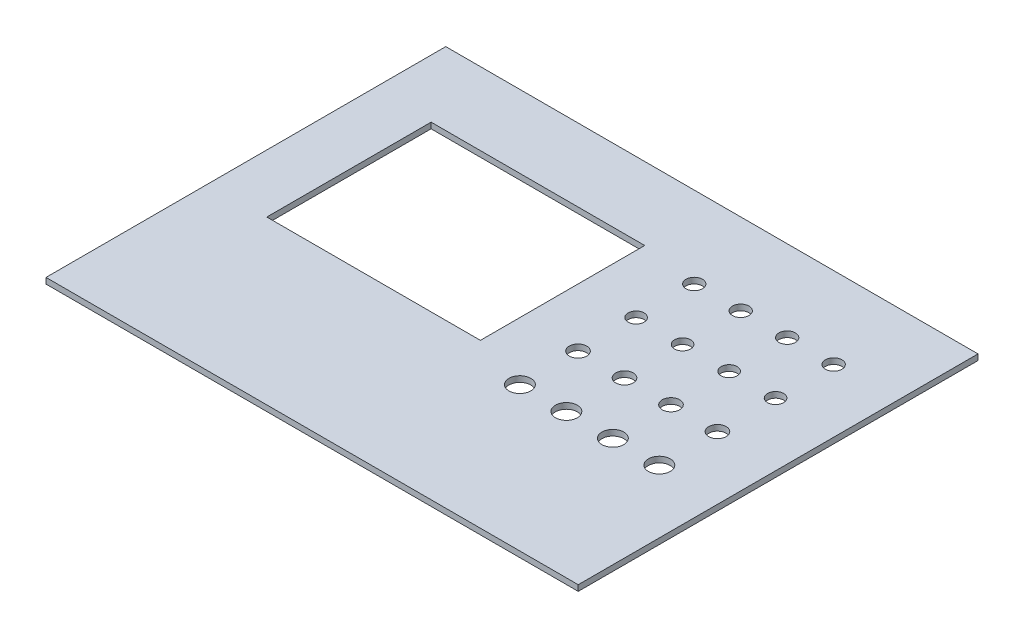
ISO-10303-21;
HEADER;
FILE_DESCRIPTION(('STEP AP214'),'2;1');
FILE_NAME('part.step','',(''),(''),'','','');
FILE_SCHEMA(('AUTOMOTIVE_DESIGN { 1 0 10303 214 1 1 1 1 }'));
ENDSEC;
DATA;
#1=APPLICATION_CONTEXT('core data for automotive mechanical design processes');
#2=APPLICATION_PROTOCOL_DEFINITION('international standard','automotive_design',2000,#1);
#3=PRODUCT_CONTEXT('',#1,'mechanical');
#4=PRODUCT('Part','Part','',(#3));
#5=PRODUCT_RELATED_PRODUCT_CATEGORY('part','',(#4));
#6=PRODUCT_DEFINITION_FORMATION('','',#4);
#7=PRODUCT_DEFINITION_CONTEXT('part definition',#1,'design');
#8=PRODUCT_DEFINITION('design','',#6,#7);
#9=PRODUCT_DEFINITION_SHAPE('','',#8);
#10=(LENGTH_UNIT() NAMED_UNIT(*) SI_UNIT(.MILLI.,.METRE.));
#11=(NAMED_UNIT(*) PLANE_ANGLE_UNIT() SI_UNIT($,.RADIAN.));
#12=(NAMED_UNIT(*) SI_UNIT($,.STERADIAN.) SOLID_ANGLE_UNIT());
#13=UNCERTAINTY_MEASURE_WITH_UNIT(LENGTH_MEASURE(1.E-05),#10,'distance_accuracy_value','');
#14=(GEOMETRIC_REPRESENTATION_CONTEXT(3) GLOBAL_UNCERTAINTY_ASSIGNED_CONTEXT((#13)) GLOBAL_UNIT_ASSIGNED_CONTEXT((#10,
#11,#12)) REPRESENTATION_CONTEXT('',''));
#15=CARTESIAN_POINT('',(0.,0.,0.));
#16=DIRECTION('',(0.,0.,1.));
#17=DIRECTION('',(1.,0.,0.));
#18=AXIS2_PLACEMENT_3D('',#15,#16,#17);
#19=CARTESIAN_POINT('',(0.,6.35,0.));
#20=DIRECTION('',(1.,0.,0.));
#21=DIRECTION('',(0.,0.,-1.));
#22=AXIS2_PLACEMENT_3D('',#19,#20,#21);
#23=PLANE('',#22);
#24=DIRECTION('',(0.,0.,1.));
#25=VECTOR('',#24,1.);
#26=CARTESIAN_POINT('',(0.,0.,0.));
#27=LINE('',#26,#25);
#28=CARTESIAN_POINT('',(0.,0.,-436.88));
#29=VERTEX_POINT('',#28);
#30=CARTESIAN_POINT('',(0.,0.,0.));
#31=VERTEX_POINT('',#30);
#32=EDGE_CURVE('E163',#29,#31,#27,.T.);
#33=ORIENTED_EDGE('',*,*,#32,.T.);
#34=DIRECTION('',(0.,-1.,0.));
#35=VECTOR('',#34,1.);
#36=CARTESIAN_POINT('',(0.,6.35,0.));
#37=LINE('',#36,#35);
#38=CARTESIAN_POINT('',(0.,6.35,0.));
#39=VERTEX_POINT('',#38);
#40=EDGE_CURVE('E11',#39,#31,#37,.T.);
#41=ORIENTED_EDGE('',*,*,#40,.F.);
#42=DIRECTION('',(0.,0.,1.));
#43=VECTOR('',#42,1.);
#44=CARTESIAN_POINT('',(0.,6.35,0.));
#45=LINE('',#44,#43);
#46=CARTESIAN_POINT('',(0.,6.35,-436.88));
#47=VERTEX_POINT('',#46);
#48=EDGE_CURVE('E169',#47,#39,#45,.T.);
#49=ORIENTED_EDGE('',*,*,#48,.F.);
#50=DIRECTION('',(0.,-1.,0.));
#51=VECTOR('',#50,1.);
#52=CARTESIAN_POINT('',(0.,6.35,-436.88));
#53=LINE('',#52,#51);
#54=EDGE_CURVE('E183',#47,#29,#53,.T.);
#55=ORIENTED_EDGE('',*,*,#54,.T.);
#56=EDGE_LOOP('',(#33,#41,#49,#55));
#57=FACE_BOUND('',#56,.T.);
#58=ADVANCED_FACE('F51',(#57),#23,.F.);
#59=CARTESIAN_POINT('',(0.,6.35,0.));
#60=DIRECTION('',(0.,0.,-1.));
#61=DIRECTION('',(-1.,0.,0.));
#62=AXIS2_PLACEMENT_3D('',#59,#60,#61);
#63=PLANE('',#62);
#64=DIRECTION('',(1.,0.,0.));
#65=VECTOR('',#64,1.);
#66=CARTESIAN_POINT('',(0.,0.,0.));
#67=LINE('',#66,#65);
#68=CARTESIAN_POINT('',(581.66,0.,0.));
#69=VERTEX_POINT('',#68);
#70=EDGE_CURVE('E187',#31,#69,#67,.T.);
#71=ORIENTED_EDGE('',*,*,#70,.T.);
#72=DIRECTION('',(0.,-1.,0.));
#73=VECTOR('',#72,1.);
#74=CARTESIAN_POINT('',(581.66,6.35,0.));
#75=LINE('',#74,#73);
#76=CARTESIAN_POINT('',(581.66,6.35,0.));
#77=VERTEX_POINT('',#76);
#78=EDGE_CURVE('E59',#77,#69,#75,.T.);
#79=ORIENTED_EDGE('',*,*,#78,.F.);
#80=DIRECTION('',(1.,0.,0.));
#81=VECTOR('',#80,1.);
#82=CARTESIAN_POINT('',(0.,6.35,0.));
#83=LINE('',#82,#81);
#84=EDGE_CURVE('E173',#39,#77,#83,.T.);
#85=ORIENTED_EDGE('',*,*,#84,.F.);
#86=ORIENTED_EDGE('',*,*,#40,.T.);
#87=EDGE_LOOP('',(#71,#79,#85,#86));
#88=FACE_BOUND('',#87,.T.);
#89=ADVANCED_FACE('F221',(#88),#63,.F.);
#90=CARTESIAN_POINT('',(581.66,6.35,0.));
#91=DIRECTION('',(-1.,0.,0.));
#92=DIRECTION('',(0.,0.,1.));
#93=AXIS2_PLACEMENT_3D('',#90,#91,#92);
#94=PLANE('',#93);
#95=DIRECTION('',(0.,0.,-1.));
#96=VECTOR('',#95,1.);
#97=CARTESIAN_POINT('',(581.66,0.,0.));
#98=LINE('',#97,#96);
#99=CARTESIAN_POINT('',(581.66,0.,-436.88));
#100=VERTEX_POINT('',#99);
#101=EDGE_CURVE('E190',#69,#100,#98,.T.);
#102=ORIENTED_EDGE('',*,*,#101,.T.);
#103=DIRECTION('',(0.,-1.,0.));
#104=VECTOR('',#103,1.);
#105=CARTESIAN_POINT('',(581.66,6.35,-436.88));
#106=LINE('',#105,#104);
#107=CARTESIAN_POINT('',(581.66,6.35,-436.88));
#108=VERTEX_POINT('',#107);
#109=EDGE_CURVE('E198',#108,#100,#106,.T.);
#110=ORIENTED_EDGE('',*,*,#109,.F.);
#111=DIRECTION('',(0.,0.,-1.));
#112=VECTOR('',#111,1.);
#113=CARTESIAN_POINT('',(581.66,6.35,0.));
#114=LINE('',#113,#112);
#115=EDGE_CURVE('E177',#77,#108,#114,.T.);
#116=ORIENTED_EDGE('',*,*,#115,.F.);
#117=ORIENTED_EDGE('',*,*,#78,.T.);
#118=EDGE_LOOP('',(#102,#110,#116,#117));
#119=FACE_BOUND('',#118,.T.);
#120=ADVANCED_FACE('F207',(#119),#94,.F.);
#121=CARTESIAN_POINT('',(0.,6.35,-436.88));
#122=DIRECTION('',(0.,0.,1.));
#123=DIRECTION('',(1.,0.,0.));
#124=AXIS2_PLACEMENT_3D('',#121,#122,#123);
#125=PLANE('',#124);
#126=DIRECTION('',(-1.,0.,0.));
#127=VECTOR('',#126,1.);
#128=CARTESIAN_POINT('',(0.,0.,-436.88));
#129=LINE('',#128,#127);
#130=EDGE_CURVE('E174',#100,#29,#129,.T.);
#131=ORIENTED_EDGE('',*,*,#130,.T.);
#132=ORIENTED_EDGE('',*,*,#54,.F.);
#133=DIRECTION('',(-1.,0.,0.));
#134=VECTOR('',#133,1.);
#135=CARTESIAN_POINT('',(0.,6.35,-436.88));
#136=LINE('',#135,#134);
#137=EDGE_CURVE('E180',#108,#47,#136,.T.);
#138=ORIENTED_EDGE('',*,*,#137,.F.);
#139=ORIENTED_EDGE('',*,*,#109,.T.);
#140=EDGE_LOOP('',(#131,#132,#138,#139));
#141=FACE_BOUND('',#140,.T.);
#142=ADVANCED_FACE('F214',(#141),#125,.F.);
#143=CARTESIAN_POINT('',(0.,6.35,0.));
#144=DIRECTION('',(0.,-1.,0.));
#145=DIRECTION('',(0.,0.,-1.));
#146=AXIS2_PLACEMENT_3D('',#143,#144,#145);
#147=PLANE('',#146);
#148=CARTESIAN_POINT('',(360.426,6.35,-157.48));
#149=DIRECTION('',(0.,1.,0.));
#150=DIRECTION('',(0.,0.,1.));
#151=AXIS2_PLACEMENT_3D('',#148,#149,#150);
#152=CIRCLE('',#151,11.938);
#153=CARTESIAN_POINT('',(360.426,6.35,-145.542));
#154=VERTEX_POINT('',#153);
#155=EDGE_CURVE('E319',#154,#154,#152,.T.);
#156=ORIENTED_EDGE('',*,*,#155,.F.);
#157=EDGE_LOOP('',(#156));
#158=FACE_BOUND('',#157,.T.);
#159=CARTESIAN_POINT('',(411.226,6.35,-157.48));
#160=DIRECTION('',(0.,1.,0.));
#161=DIRECTION('',(0.,0.,1.));
#162=AXIS2_PLACEMENT_3D('',#159,#160,#161);
#163=CIRCLE('',#162,11.938);
#164=CARTESIAN_POINT('',(411.226,6.35,-145.542));
#165=VERTEX_POINT('',#164);
#166=EDGE_CURVE('E321',#165,#165,#163,.T.);
#167=ORIENTED_EDGE('',*,*,#166,.F.);
#168=EDGE_LOOP('',(#167));
#169=FACE_BOUND('',#168,.T.);
#170=CARTESIAN_POINT('',(462.026,6.35,-157.48));
#171=DIRECTION('',(0.,1.,0.));
#172=DIRECTION('',(0.,0.,1.));
#173=AXIS2_PLACEMENT_3D('',#170,#171,#172);
#174=CIRCLE('',#173,11.938);
#175=CARTESIAN_POINT('',(462.026,6.35,-145.542));
#176=VERTEX_POINT('',#175);
#177=EDGE_CURVE('E334',#176,#176,#174,.T.);
#178=ORIENTED_EDGE('',*,*,#177,.F.);
#179=EDGE_LOOP('',(#178));
#180=FACE_BOUND('',#179,.T.);
#181=CARTESIAN_POINT('',(512.826,6.35,-157.48));
#182=DIRECTION('',(0.,1.,0.));
#183=DIRECTION('',(0.,0.,1.));
#184=AXIS2_PLACEMENT_3D('',#181,#182,#183);
#185=CIRCLE('',#184,11.938);
#186=CARTESIAN_POINT('',(512.826,6.35,-145.542));
#187=VERTEX_POINT('',#186);
#188=EDGE_CURVE('E342',#187,#187,#185,.T.);
#189=ORIENTED_EDGE('',*,*,#188,.F.);
#190=EDGE_LOOP('',(#189));
#191=FACE_BOUND('',#190,.T.);
#192=CARTESIAN_POINT('',(360.426,6.35,-220.98));
#193=DIRECTION('',(0.,1.,0.));
#194=DIRECTION('',(0.,0.,1.));
#195=AXIS2_PLACEMENT_3D('',#192,#193,#194);
#196=CIRCLE('',#195,9.52500000000002);
#197=CARTESIAN_POINT('',(360.426,6.35,-211.455));
#198=VERTEX_POINT('',#197);
#199=EDGE_CURVE('E355',#198,#198,#196,.T.);
#200=ORIENTED_EDGE('',*,*,#199,.F.);
#201=EDGE_LOOP('',(#200));
#202=FACE_BOUND('',#201,.T.);
#203=CARTESIAN_POINT('',(411.226,6.35,-220.98));
#204=DIRECTION('',(0.,1.,0.));
#205=DIRECTION('',(0.,0.,1.));
#206=AXIS2_PLACEMENT_3D('',#203,#204,#205);
#207=CIRCLE('',#206,9.52500000000002);
#208=CARTESIAN_POINT('',(411.226,6.35,-211.455));
#209=VERTEX_POINT('',#208);
#210=EDGE_CURVE('E359',#209,#209,#207,.T.);
#211=ORIENTED_EDGE('',*,*,#210,.F.);
#212=EDGE_LOOP('',(#211));
#213=FACE_BOUND('',#212,.T.);
#214=CARTESIAN_POINT('',(462.026,6.35,-220.98));
#215=DIRECTION('',(0.,1.,0.));
#216=DIRECTION('',(0.,0.,1.));
#217=AXIS2_PLACEMENT_3D('',#214,#215,#216);
#218=CIRCLE('',#217,9.52500000000002);
#219=CARTESIAN_POINT('',(462.026,6.35,-211.455));
#220=VERTEX_POINT('',#219);
#221=EDGE_CURVE('E367',#220,#220,#218,.T.);
#222=ORIENTED_EDGE('',*,*,#221,.F.);
#223=EDGE_LOOP('',(#222));
#224=FACE_BOUND('',#223,.T.);
#225=CARTESIAN_POINT('',(512.826,6.35,-220.98));
#226=DIRECTION('',(0.,1.,0.));
#227=DIRECTION('',(0.,0.,1.));
#228=AXIS2_PLACEMENT_3D('',#225,#226,#227);
#229=CIRCLE('',#228,9.52500000000002);
#230=CARTESIAN_POINT('',(512.826,6.35,-211.455));
#231=VERTEX_POINT('',#230);
#232=EDGE_CURVE('E375',#231,#231,#229,.T.);
#233=ORIENTED_EDGE('',*,*,#232,.F.);
#234=EDGE_LOOP('',(#233));
#235=FACE_BOUND('',#234,.T.);
#236=CARTESIAN_POINT('',(360.426,6.35,-284.48));
#237=DIRECTION('',(0.,1.,0.));
#238=DIRECTION('',(0.,0.,1.));
#239=AXIS2_PLACEMENT_3D('',#236,#237,#238);
#240=CIRCLE('',#239,8.76300000000004);
#241=CARTESIAN_POINT('',(360.426,6.35,-275.717));
#242=VERTEX_POINT('',#241);
#243=EDGE_CURVE('E386',#242,#242,#240,.T.);
#244=ORIENTED_EDGE('',*,*,#243,.F.);
#245=EDGE_LOOP('',(#244));
#246=FACE_BOUND('',#245,.T.);
#247=CARTESIAN_POINT('',(411.226,6.35,-284.48));
#248=DIRECTION('',(0.,1.,0.));
#249=DIRECTION('',(0.,0.,1.));
#250=AXIS2_PLACEMENT_3D('',#247,#248,#249);
#251=CIRCLE('',#250,8.76300000000004);
#252=CARTESIAN_POINT('',(411.226,6.35,-275.717));
#253=VERTEX_POINT('',#252);
#254=EDGE_CURVE('E390',#253,#253,#251,.T.);
#255=ORIENTED_EDGE('',*,*,#254,.F.);
#256=EDGE_LOOP('',(#255));
#257=FACE_BOUND('',#256,.T.);
#258=CARTESIAN_POINT('',(462.026,6.35,-284.48));
#259=DIRECTION('',(0.,1.,0.));
#260=DIRECTION('',(0.,0.,1.));
#261=AXIS2_PLACEMENT_3D('',#258,#259,#260);
#262=CIRCLE('',#261,8.76300000000004);
#263=CARTESIAN_POINT('',(462.026,6.35,-275.717));
#264=VERTEX_POINT('',#263);
#265=EDGE_CURVE('E398',#264,#264,#262,.T.);
#266=ORIENTED_EDGE('',*,*,#265,.F.);
#267=EDGE_LOOP('',(#266));
#268=FACE_BOUND('',#267,.T.);
#269=CARTESIAN_POINT('',(512.826,6.35,-284.48));
#270=DIRECTION('',(0.,1.,0.));
#271=DIRECTION('',(0.,0.,1.));
#272=AXIS2_PLACEMENT_3D('',#269,#270,#271);
#273=CIRCLE('',#272,8.76300000000004);
#274=CARTESIAN_POINT('',(512.826,6.35,-275.717));
#275=VERTEX_POINT('',#274);
#276=EDGE_CURVE('E406',#275,#275,#273,.T.);
#277=ORIENTED_EDGE('',*,*,#276,.F.);
#278=EDGE_LOOP('',(#277));
#279=FACE_BOUND('',#278,.T.);
#280=CARTESIAN_POINT('',(360.426,6.35,-347.98));
#281=DIRECTION('',(0.,1.,0.));
#282=DIRECTION('',(0.,0.,1.));
#283=AXIS2_PLACEMENT_3D('',#280,#281,#282);
#284=CIRCLE('',#283,9.01700000000002);
#285=CARTESIAN_POINT('',(360.426,6.35,-338.963));
#286=VERTEX_POINT('',#285);
#287=EDGE_CURVE('E416',#286,#286,#284,.T.);
#288=ORIENTED_EDGE('',*,*,#287,.F.);
#289=EDGE_LOOP('',(#288));
#290=FACE_BOUND('',#289,.T.);
#291=CARTESIAN_POINT('',(411.226,6.35,-347.98));
#292=DIRECTION('',(0.,1.,0.));
#293=DIRECTION('',(0.,0.,1.));
#294=AXIS2_PLACEMENT_3D('',#291,#292,#293);
#295=CIRCLE('',#294,9.01700000000002);
#296=CARTESIAN_POINT('',(411.226,6.35,-338.963));
#297=VERTEX_POINT('',#296);
#298=EDGE_CURVE('E420',#297,#297,#295,.T.);
#299=ORIENTED_EDGE('',*,*,#298,.F.);
#300=EDGE_LOOP('',(#299));
#301=FACE_BOUND('',#300,.T.);
#302=CARTESIAN_POINT('',(462.026,6.35,-347.98));
#303=DIRECTION('',(0.,1.,0.));
#304=DIRECTION('',(0.,0.,1.));
#305=AXIS2_PLACEMENT_3D('',#302,#303,#304);
#306=CIRCLE('',#305,9.01700000000007);
#307=CARTESIAN_POINT('',(462.026,6.35,-338.963));
#308=VERTEX_POINT('',#307);
#309=EDGE_CURVE('E428',#308,#308,#306,.T.);
#310=ORIENTED_EDGE('',*,*,#309,.F.);
#311=EDGE_LOOP('',(#310));
#312=FACE_BOUND('',#311,.T.);
#313=CARTESIAN_POINT('',(512.826,6.35,-347.98));
#314=DIRECTION('',(0.,1.,0.));
#315=DIRECTION('',(0.,0.,1.));
#316=AXIS2_PLACEMENT_3D('',#313,#314,#315);
#317=CIRCLE('',#316,9.01700000000007);
#318=CARTESIAN_POINT('',(512.826,6.35,-338.963));
#319=VERTEX_POINT('',#318);
#320=EDGE_CURVE('E435',#319,#319,#317,.T.);
#321=ORIENTED_EDGE('',*,*,#320,.F.);
#322=EDGE_LOOP('',(#321));
#323=FACE_BOUND('',#322,.T.);
#324=DIRECTION('',(1.,0.,0.));
#325=VECTOR('',#324,1.);
#326=CARTESIAN_POINT('',(63.4999999999999,6.35,-177.8));
#327=LINE('',#326,#325);
#328=CARTESIAN_POINT('',(63.4999999999999,6.35,-177.8));
#329=VERTEX_POINT('',#328);
#330=CARTESIAN_POINT('',(296.926,6.35,-177.8));
#331=VERTEX_POINT('',#330);
#332=EDGE_CURVE('E153',#329,#331,#327,.T.);
#333=ORIENTED_EDGE('',*,*,#332,.F.);
#334=DIRECTION('',(0.,0.,1.));
#335=VECTOR('',#334,1.);
#336=CARTESIAN_POINT('',(63.5000000000001,6.35,-357.378));
#337=LINE('',#336,#335);
#338=CARTESIAN_POINT('',(63.5000000000001,6.35,-357.378));
#339=VERTEX_POINT('',#338);
#340=EDGE_CURVE('E66',#339,#329,#337,.T.);
#341=ORIENTED_EDGE('',*,*,#340,.F.);
#342=DIRECTION('',(-1.,0.,0.));
#343=VECTOR('',#342,1.);
#344=CARTESIAN_POINT('',(63.5000000000001,6.35,-357.378));
#345=LINE('',#344,#343);
#346=CARTESIAN_POINT('',(296.926,6.35,-357.378));
#347=VERTEX_POINT('',#346);
#348=EDGE_CURVE('E137',#347,#339,#345,.T.);
#349=ORIENTED_EDGE('',*,*,#348,.F.);
#350=DIRECTION('',(0.,0.,-1.));
#351=VECTOR('',#350,1.);
#352=CARTESIAN_POINT('',(296.926,6.35,-357.378));
#353=LINE('',#352,#351);
#354=EDGE_CURVE('E141',#331,#347,#353,.T.);
#355=ORIENTED_EDGE('',*,*,#354,.F.);
#356=EDGE_LOOP('',(#333,#341,#349,#355));
#357=FACE_BOUND('',#356,.T.);
#358=ORIENTED_EDGE('',*,*,#48,.T.);
#359=ORIENTED_EDGE('',*,*,#84,.T.);
#360=ORIENTED_EDGE('',*,*,#115,.T.);
#361=ORIENTED_EDGE('',*,*,#137,.T.);
#362=EDGE_LOOP('',(#358,#359,#360,#361));
#363=FACE_BOUND('',#362,.T.);
#364=ADVANCED_FACE('F220',(#158,#169,#180,#191,#202,#213,#224,#235,#246,#257,#268,#279,#290,
#301,#312,#323,#357,#363),#147,.F.);
#365=CARTESIAN_POINT('',(0.,0.,0.));
#366=DIRECTION('',(0.,-1.,0.));
#367=DIRECTION('',(0.,0.,-1.));
#368=AXIS2_PLACEMENT_3D('',#365,#366,#367);
#369=PLANE('',#368);
#370=CARTESIAN_POINT('',(360.426,0.,-157.48));
#371=DIRECTION('',(0.,1.,0.));
#372=DIRECTION('',(0.,0.,1.));
#373=AXIS2_PLACEMENT_3D('',#370,#371,#372);
#374=CIRCLE('',#373,11.938);
#375=CARTESIAN_POINT('',(360.426,0.,-145.542));
#376=VERTEX_POINT('',#375);
#377=EDGE_CURVE('E316',#376,#376,#374,.T.);
#378=ORIENTED_EDGE('',*,*,#377,.T.);
#379=EDGE_LOOP('',(#378));
#380=FACE_BOUND('',#379,.T.);
#381=CARTESIAN_POINT('',(411.226,0.,-157.48));
#382=DIRECTION('',(0.,1.,0.));
#383=DIRECTION('',(0.,0.,1.));
#384=AXIS2_PLACEMENT_3D('',#381,#382,#383);
#385=CIRCLE('',#384,11.938);
#386=CARTESIAN_POINT('',(411.226,0.,-145.542));
#387=VERTEX_POINT('',#386);
#388=EDGE_CURVE('E328',#387,#387,#385,.T.);
#389=ORIENTED_EDGE('',*,*,#388,.T.);
#390=EDGE_LOOP('',(#389));
#391=FACE_BOUND('',#390,.T.);
#392=CARTESIAN_POINT('',(462.026,0.,-157.48));
#393=DIRECTION('',(0.,1.,0.));
#394=DIRECTION('',(0.,0.,1.));
#395=AXIS2_PLACEMENT_3D('',#392,#393,#394);
#396=CIRCLE('',#395,11.938);
#397=CARTESIAN_POINT('',(462.026,0.,-145.542));
#398=VERTEX_POINT('',#397);
#399=EDGE_CURVE('E338',#398,#398,#396,.T.);
#400=ORIENTED_EDGE('',*,*,#399,.T.);
#401=EDGE_LOOP('',(#400));
#402=FACE_BOUND('',#401,.T.);
#403=CARTESIAN_POINT('',(512.826,0.,-157.48));
#404=DIRECTION('',(0.,1.,0.));
#405=DIRECTION('',(0.,0.,1.));
#406=AXIS2_PLACEMENT_3D('',#403,#404,#405);
#407=CIRCLE('',#406,11.938);
#408=CARTESIAN_POINT('',(512.826,0.,-145.542));
#409=VERTEX_POINT('',#408);
#410=EDGE_CURVE('E346',#409,#409,#407,.T.);
#411=ORIENTED_EDGE('',*,*,#410,.T.);
#412=EDGE_LOOP('',(#411));
#413=FACE_BOUND('',#412,.T.);
#414=CARTESIAN_POINT('',(360.426,0.,-220.98));
#415=DIRECTION('',(0.,1.,0.));
#416=DIRECTION('',(0.,0.,1.));
#417=AXIS2_PLACEMENT_3D('',#414,#415,#416);
#418=CIRCLE('',#417,9.52500000000002);
#419=CARTESIAN_POINT('',(360.426,0.,-211.455));
#420=VERTEX_POINT('',#419);
#421=EDGE_CURVE('E350',#420,#420,#418,.T.);
#422=ORIENTED_EDGE('',*,*,#421,.T.);
#423=EDGE_LOOP('',(#422));
#424=FACE_BOUND('',#423,.T.);
#425=CARTESIAN_POINT('',(411.226,0.,-220.98));
#426=DIRECTION('',(0.,1.,0.));
#427=DIRECTION('',(0.,0.,1.));
#428=AXIS2_PLACEMENT_3D('',#425,#426,#427);
#429=CIRCLE('',#428,9.52500000000002);
#430=CARTESIAN_POINT('',(411.226,0.,-211.455));
#431=VERTEX_POINT('',#430);
#432=EDGE_CURVE('E363',#431,#431,#429,.T.);
#433=ORIENTED_EDGE('',*,*,#432,.T.);
#434=EDGE_LOOP('',(#433));
#435=FACE_BOUND('',#434,.T.);
#436=CARTESIAN_POINT('',(462.026,0.,-220.98));
#437=DIRECTION('',(0.,1.,0.));
#438=DIRECTION('',(0.,0.,1.));
#439=AXIS2_PLACEMENT_3D('',#436,#437,#438);
#440=CIRCLE('',#439,9.52500000000002);
#441=CARTESIAN_POINT('',(462.026,0.,-211.455));
#442=VERTEX_POINT('',#441);
#443=EDGE_CURVE('E371',#442,#442,#440,.T.);
#444=ORIENTED_EDGE('',*,*,#443,.T.);
#445=EDGE_LOOP('',(#444));
#446=FACE_BOUND('',#445,.T.);
#447=CARTESIAN_POINT('',(512.826,0.,-220.98));
#448=DIRECTION('',(0.,1.,0.));
#449=DIRECTION('',(0.,0.,1.));
#450=AXIS2_PLACEMENT_3D('',#447,#448,#449);
#451=CIRCLE('',#450,9.52500000000002);
#452=CARTESIAN_POINT('',(512.826,0.,-211.455));
#453=VERTEX_POINT('',#452);
#454=EDGE_CURVE('E325',#453,#453,#451,.T.);
#455=ORIENTED_EDGE('',*,*,#454,.T.);
#456=EDGE_LOOP('',(#455));
#457=FACE_BOUND('',#456,.T.);
#458=CARTESIAN_POINT('',(360.426,0.,-284.48));
#459=DIRECTION('',(0.,1.,0.));
#460=DIRECTION('',(0.,0.,1.));
#461=AXIS2_PLACEMENT_3D('',#458,#459,#460);
#462=CIRCLE('',#461,8.76300000000004);
#463=CARTESIAN_POINT('',(360.426,0.,-275.717));
#464=VERTEX_POINT('',#463);
#465=EDGE_CURVE('E382',#464,#464,#462,.T.);
#466=ORIENTED_EDGE('',*,*,#465,.T.);
#467=EDGE_LOOP('',(#466));
#468=FACE_BOUND('',#467,.T.);
#469=CARTESIAN_POINT('',(411.226,0.,-284.48));
#470=DIRECTION('',(0.,1.,0.));
#471=DIRECTION('',(0.,0.,1.));
#472=AXIS2_PLACEMENT_3D('',#469,#470,#471);
#473=CIRCLE('',#472,8.76300000000004);
#474=CARTESIAN_POINT('',(411.226,0.,-275.717));
#475=VERTEX_POINT('',#474);
#476=EDGE_CURVE('E394',#475,#475,#473,.T.);
#477=ORIENTED_EDGE('',*,*,#476,.T.);
#478=EDGE_LOOP('',(#477));
#479=FACE_BOUND('',#478,.T.);
#480=CARTESIAN_POINT('',(462.026,0.,-284.48));
#481=DIRECTION('',(0.,1.,0.));
#482=DIRECTION('',(0.,0.,1.));
#483=AXIS2_PLACEMENT_3D('',#480,#481,#482);
#484=CIRCLE('',#483,8.76300000000004);
#485=CARTESIAN_POINT('',(462.026,0.,-275.717));
#486=VERTEX_POINT('',#485);
#487=EDGE_CURVE('E402',#486,#486,#484,.T.);
#488=ORIENTED_EDGE('',*,*,#487,.T.);
#489=EDGE_LOOP('',(#488));
#490=FACE_BOUND('',#489,.T.);
#491=CARTESIAN_POINT('',(512.826,0.,-284.48));
#492=DIRECTION('',(0.,1.,0.));
#493=DIRECTION('',(0.,0.,1.));
#494=AXIS2_PLACEMENT_3D('',#491,#492,#493);
#495=CIRCLE('',#494,8.76300000000004);
#496=CARTESIAN_POINT('',(512.826,0.,-275.717));
#497=VERTEX_POINT('',#496);
#498=EDGE_CURVE('E354',#497,#497,#495,.T.);
#499=ORIENTED_EDGE('',*,*,#498,.T.);
#500=EDGE_LOOP('',(#499));
#501=FACE_BOUND('',#500,.T.);
#502=CARTESIAN_POINT('',(360.426,0.,-347.98));
#503=DIRECTION('',(0.,1.,0.));
#504=DIRECTION('',(0.,0.,1.));
#505=AXIS2_PLACEMENT_3D('',#502,#503,#504);
#506=CIRCLE('',#505,9.01700000000002);
#507=CARTESIAN_POINT('',(360.426,0.,-338.963));
#508=VERTEX_POINT('',#507);
#509=EDGE_CURVE('E154',#508,#508,#506,.T.);
#510=ORIENTED_EDGE('',*,*,#509,.T.);
#511=EDGE_LOOP('',(#510));
#512=FACE_BOUND('',#511,.T.);
#513=CARTESIAN_POINT('',(411.226,0.,-347.98));
#514=DIRECTION('',(0.,1.,0.));
#515=DIRECTION('',(0.,0.,1.));
#516=AXIS2_PLACEMENT_3D('',#513,#514,#515);
#517=CIRCLE('',#516,9.01700000000002);
#518=CARTESIAN_POINT('',(411.226,0.,-338.963));
#519=VERTEX_POINT('',#518);
#520=EDGE_CURVE('E424',#519,#519,#517,.T.);
#521=ORIENTED_EDGE('',*,*,#520,.T.);
#522=EDGE_LOOP('',(#521));
#523=FACE_BOUND('',#522,.T.);
#524=CARTESIAN_POINT('',(462.026,0.,-347.98));
#525=DIRECTION('',(0.,1.,0.));
#526=DIRECTION('',(0.,0.,1.));
#527=AXIS2_PLACEMENT_3D('',#524,#525,#526);
#528=CIRCLE('',#527,9.01700000000007);
#529=CARTESIAN_POINT('',(462.026,0.,-338.963));
#530=VERTEX_POINT('',#529);
#531=EDGE_CURVE('E432',#530,#530,#528,.T.);
#532=ORIENTED_EDGE('',*,*,#531,.T.);
#533=EDGE_LOOP('',(#532));
#534=FACE_BOUND('',#533,.T.);
#535=CARTESIAN_POINT('',(512.826,0.,-347.98));
#536=DIRECTION('',(0.,1.,0.));
#537=DIRECTION('',(0.,0.,1.));
#538=AXIS2_PLACEMENT_3D('',#535,#536,#537);
#539=CIRCLE('',#538,9.01700000000007);
#540=CARTESIAN_POINT('',(512.826,0.,-338.963));
#541=VERTEX_POINT('',#540);
#542=EDGE_CURVE('E144',#541,#541,#539,.T.);
#543=ORIENTED_EDGE('',*,*,#542,.T.);
#544=EDGE_LOOP('',(#543));
#545=FACE_BOUND('',#544,.T.);
#546=DIRECTION('',(0.,0.,1.));
#547=VECTOR('',#546,1.);
#548=CARTESIAN_POINT('',(63.5000000000001,0.,-357.378));
#549=LINE('',#548,#547);
#550=CARTESIAN_POINT('',(63.5000000000001,0.,-357.378));
#551=VERTEX_POINT('',#550);
#552=CARTESIAN_POINT('',(63.4999999999999,0.,-177.8));
#553=VERTEX_POINT('',#552);
#554=EDGE_CURVE('E118',#551,#553,#549,.T.);
#555=ORIENTED_EDGE('',*,*,#554,.T.);
#556=DIRECTION('',(1.,0.,0.));
#557=VECTOR('',#556,1.);
#558=CARTESIAN_POINT('',(63.4999999999999,0.,-177.8));
#559=LINE('',#558,#557);
#560=CARTESIAN_POINT('',(296.926,0.,-177.8));
#561=VERTEX_POINT('',#560);
#562=EDGE_CURVE('E128',#553,#561,#559,.T.);
#563=ORIENTED_EDGE('',*,*,#562,.T.);
#564=DIRECTION('',(0.,0.,-1.));
#565=VECTOR('',#564,1.);
#566=CARTESIAN_POINT('',(296.926,0.,-357.378));
#567=LINE('',#566,#565);
#568=CARTESIAN_POINT('',(296.926,0.,-357.378));
#569=VERTEX_POINT('',#568);
#570=EDGE_CURVE('E74',#561,#569,#567,.T.);
#571=ORIENTED_EDGE('',*,*,#570,.T.);
#572=DIRECTION('',(-1.,0.,0.));
#573=VECTOR('',#572,1.);
#574=CARTESIAN_POINT('',(63.5000000000001,0.,-357.378));
#575=LINE('',#574,#573);
#576=EDGE_CURVE('E125',#569,#551,#575,.T.);
#577=ORIENTED_EDGE('',*,*,#576,.T.);
#578=EDGE_LOOP('',(#555,#563,#571,#577));
#579=FACE_BOUND('',#578,.T.);
#580=ORIENTED_EDGE('',*,*,#32,.F.);
#581=ORIENTED_EDGE('',*,*,#130,.F.);
#582=ORIENTED_EDGE('',*,*,#101,.F.);
#583=ORIENTED_EDGE('',*,*,#70,.F.);
#584=EDGE_LOOP('',(#580,#581,#582,#583));
#585=FACE_BOUND('',#584,.T.);
#586=ADVANCED_FACE('F133',(#380,#391,#402,#413,#424,#435,#446,#457,#468,#479,#490,#501,#512,
#523,#534,#545,#579,#585),#369,.T.);
#587=CARTESIAN_POINT('',(63.5000000000001,0.,-357.378));
#588=DIRECTION('',(-1.,0.,0.));
#589=DIRECTION('',(0.,0.,1.));
#590=AXIS2_PLACEMENT_3D('',#587,#588,#589);
#591=PLANE('',#590);
#592=ORIENTED_EDGE('',*,*,#340,.T.);
#593=DIRECTION('',(0.,1.,0.));
#594=VECTOR('',#593,1.);
#595=CARTESIAN_POINT('',(63.4999999999999,0.,-177.8));
#596=LINE('',#595,#594);
#597=EDGE_CURVE('E114',#553,#329,#596,.T.);
#598=ORIENTED_EDGE('',*,*,#597,.F.);
#599=ORIENTED_EDGE('',*,*,#554,.F.);
#600=DIRECTION('',(0.,1.,0.));
#601=VECTOR('',#600,1.);
#602=CARTESIAN_POINT('',(63.5000000000001,0.,-357.378));
#603=LINE('',#602,#601);
#604=EDGE_CURVE('E160',#551,#339,#603,.T.);
#605=ORIENTED_EDGE('',*,*,#604,.T.);
#606=EDGE_LOOP('',(#592,#598,#599,#605));
#607=FACE_BOUND('',#606,.T.);
#608=ADVANCED_FACE('F116',(#607),#591,.F.);
#609=CARTESIAN_POINT('',(63.5000000000001,0.,-357.378));
#610=DIRECTION('',(0.,0.,-1.));
#611=DIRECTION('',(-1.,0.,0.));
#612=AXIS2_PLACEMENT_3D('',#609,#610,#611);
#613=PLANE('',#612);
#614=ORIENTED_EDGE('',*,*,#348,.T.);
#615=ORIENTED_EDGE('',*,*,#604,.F.);
#616=ORIENTED_EDGE('',*,*,#576,.F.);
#617=DIRECTION('',(0.,1.,0.));
#618=VECTOR('',#617,1.);
#619=CARTESIAN_POINT('',(296.926,0.,-357.378));
#620=LINE('',#619,#618);
#621=EDGE_CURVE('E164',#569,#347,#620,.T.);
#622=ORIENTED_EDGE('',*,*,#621,.T.);
#623=EDGE_LOOP('',(#614,#615,#616,#622));
#624=FACE_BOUND('',#623,.T.);
#625=ADVANCED_FACE('F239',(#624),#613,.F.);
#626=CARTESIAN_POINT('',(296.926,0.,-357.378));
#627=DIRECTION('',(1.,0.,0.));
#628=DIRECTION('',(0.,0.,-1.));
#629=AXIS2_PLACEMENT_3D('',#626,#627,#628);
#630=PLANE('',#629);
#631=ORIENTED_EDGE('',*,*,#354,.T.);
#632=ORIENTED_EDGE('',*,*,#621,.F.);
#633=ORIENTED_EDGE('',*,*,#570,.F.);
#634=DIRECTION('',(0.,1.,0.));
#635=VECTOR('',#634,1.);
#636=CARTESIAN_POINT('',(296.926,0.,-177.8));
#637=LINE('',#636,#635);
#638=EDGE_CURVE('E124',#561,#331,#637,.T.);
#639=ORIENTED_EDGE('',*,*,#638,.T.);
#640=EDGE_LOOP('',(#631,#632,#633,#639));
#641=FACE_BOUND('',#640,.T.);
#642=ADVANCED_FACE('F243',(#641),#630,.F.);
#643=CARTESIAN_POINT('',(63.4999999999999,0.,-177.8));
#644=DIRECTION('',(0.,0.,1.));
#645=DIRECTION('',(1.,0.,0.));
#646=AXIS2_PLACEMENT_3D('',#643,#644,#645);
#647=PLANE('',#646);
#648=ORIENTED_EDGE('',*,*,#332,.T.);
#649=ORIENTED_EDGE('',*,*,#638,.F.);
#650=ORIENTED_EDGE('',*,*,#562,.F.);
#651=ORIENTED_EDGE('',*,*,#597,.T.);
#652=EDGE_LOOP('',(#648,#649,#650,#651));
#653=FACE_BOUND('',#652,.T.);
#654=ADVANCED_FACE('F129',(#653),#647,.F.);
#655=CARTESIAN_POINT('',(512.826,0.,-347.98));
#656=DIRECTION('',(0.,1.,0.));
#657=DIRECTION('',(0.,0.,1.));
#658=AXIS2_PLACEMENT_3D('',#655,#656,#657);
#659=CYLINDRICAL_SURFACE('',#658,9.01700000000007);
#660=ORIENTED_EDGE('',*,*,#542,.F.);
#661=EDGE_LOOP('',(#660));
#662=FACE_BOUND('',#661,.T.);
#663=ORIENTED_EDGE('',*,*,#320,.T.);
#664=EDGE_LOOP('',(#663));
#665=FACE_BOUND('',#664,.T.);
#666=ADVANCED_FACE('F242',(#662,#665),#659,.F.);
#667=CARTESIAN_POINT('',(462.026,0.,-347.98));
#668=DIRECTION('',(0.,1.,0.));
#669=DIRECTION('',(0.,0.,1.));
#670=AXIS2_PLACEMENT_3D('',#667,#668,#669);
#671=CYLINDRICAL_SURFACE('',#670,9.01700000000007);
#672=ORIENTED_EDGE('',*,*,#531,.F.);
#673=EDGE_LOOP('',(#672));
#674=FACE_BOUND('',#673,.T.);
#675=ORIENTED_EDGE('',*,*,#309,.T.);
#676=EDGE_LOOP('',(#675));
#677=FACE_BOUND('',#676,.T.);
#678=ADVANCED_FACE('F251',(#674,#677),#671,.F.);
#679=CARTESIAN_POINT('',(411.226,0.,-347.98));
#680=DIRECTION('',(0.,1.,0.));
#681=DIRECTION('',(0.,0.,1.));
#682=AXIS2_PLACEMENT_3D('',#679,#680,#681);
#683=CYLINDRICAL_SURFACE('',#682,9.01700000000002);
#684=ORIENTED_EDGE('',*,*,#520,.F.);
#685=EDGE_LOOP('',(#684));
#686=FACE_BOUND('',#685,.T.);
#687=ORIENTED_EDGE('',*,*,#298,.T.);
#688=EDGE_LOOP('',(#687));
#689=FACE_BOUND('',#688,.T.);
#690=ADVANCED_FACE('F255',(#686,#689),#683,.F.);
#691=CARTESIAN_POINT('',(360.426,0.,-347.98));
#692=DIRECTION('',(0.,1.,0.));
#693=DIRECTION('',(0.,0.,1.));
#694=AXIS2_PLACEMENT_3D('',#691,#692,#693);
#695=CYLINDRICAL_SURFACE('',#694,9.01700000000002);
#696=ORIENTED_EDGE('',*,*,#509,.F.);
#697=EDGE_LOOP('',(#696));
#698=FACE_BOUND('',#697,.T.);
#699=ORIENTED_EDGE('',*,*,#287,.T.);
#700=EDGE_LOOP('',(#699));
#701=FACE_BOUND('',#700,.T.);
#702=ADVANCED_FACE('F259',(#698,#701),#695,.F.);
#703=CARTESIAN_POINT('',(512.826,0.,-284.48));
#704=DIRECTION('',(0.,1.,0.));
#705=DIRECTION('',(0.,0.,1.));
#706=AXIS2_PLACEMENT_3D('',#703,#704,#705);
#707=CYLINDRICAL_SURFACE('',#706,8.76300000000004);
#708=ORIENTED_EDGE('',*,*,#498,.F.);
#709=EDGE_LOOP('',(#708));
#710=FACE_BOUND('',#709,.T.);
#711=ORIENTED_EDGE('',*,*,#276,.T.);
#712=EDGE_LOOP('',(#711));
#713=FACE_BOUND('',#712,.T.);
#714=ADVANCED_FACE('F263',(#710,#713),#707,.F.);
#715=CARTESIAN_POINT('',(462.026,0.,-284.48));
#716=DIRECTION('',(0.,1.,0.));
#717=DIRECTION('',(0.,0.,1.));
#718=AXIS2_PLACEMENT_3D('',#715,#716,#717);
#719=CYLINDRICAL_SURFACE('',#718,8.76300000000004);
#720=ORIENTED_EDGE('',*,*,#487,.F.);
#721=EDGE_LOOP('',(#720));
#722=FACE_BOUND('',#721,.T.);
#723=ORIENTED_EDGE('',*,*,#265,.T.);
#724=EDGE_LOOP('',(#723));
#725=FACE_BOUND('',#724,.T.);
#726=ADVANCED_FACE('F267',(#722,#725),#719,.F.);
#727=CARTESIAN_POINT('',(411.226,0.,-284.48));
#728=DIRECTION('',(0.,1.,0.));
#729=DIRECTION('',(0.,0.,1.));
#730=AXIS2_PLACEMENT_3D('',#727,#728,#729);
#731=CYLINDRICAL_SURFACE('',#730,8.76300000000004);
#732=ORIENTED_EDGE('',*,*,#476,.F.);
#733=EDGE_LOOP('',(#732));
#734=FACE_BOUND('',#733,.T.);
#735=ORIENTED_EDGE('',*,*,#254,.T.);
#736=EDGE_LOOP('',(#735));
#737=FACE_BOUND('',#736,.T.);
#738=ADVANCED_FACE('F271',(#734,#737),#731,.F.);
#739=CARTESIAN_POINT('',(360.426,0.,-284.48));
#740=DIRECTION('',(0.,1.,0.));
#741=DIRECTION('',(0.,0.,1.));
#742=AXIS2_PLACEMENT_3D('',#739,#740,#741);
#743=CYLINDRICAL_SURFACE('',#742,8.76300000000004);
#744=ORIENTED_EDGE('',*,*,#465,.F.);
#745=EDGE_LOOP('',(#744));
#746=FACE_BOUND('',#745,.T.);
#747=ORIENTED_EDGE('',*,*,#243,.T.);
#748=EDGE_LOOP('',(#747));
#749=FACE_BOUND('',#748,.T.);
#750=ADVANCED_FACE('F275',(#746,#749),#743,.F.);
#751=CARTESIAN_POINT('',(512.826,0.,-220.98));
#752=DIRECTION('',(0.,1.,0.));
#753=DIRECTION('',(0.,0.,1.));
#754=AXIS2_PLACEMENT_3D('',#751,#752,#753);
#755=CYLINDRICAL_SURFACE('',#754,9.52500000000002);
#756=ORIENTED_EDGE('',*,*,#454,.F.);
#757=EDGE_LOOP('',(#756));
#758=FACE_BOUND('',#757,.T.);
#759=ORIENTED_EDGE('',*,*,#232,.T.);
#760=EDGE_LOOP('',(#759));
#761=FACE_BOUND('',#760,.T.);
#762=ADVANCED_FACE('F279',(#758,#761),#755,.F.);
#763=CARTESIAN_POINT('',(462.026,0.,-220.98));
#764=DIRECTION('',(0.,1.,0.));
#765=DIRECTION('',(0.,0.,1.));
#766=AXIS2_PLACEMENT_3D('',#763,#764,#765);
#767=CYLINDRICAL_SURFACE('',#766,9.52500000000002);
#768=ORIENTED_EDGE('',*,*,#443,.F.);
#769=EDGE_LOOP('',(#768));
#770=FACE_BOUND('',#769,.T.);
#771=ORIENTED_EDGE('',*,*,#221,.T.);
#772=EDGE_LOOP('',(#771));
#773=FACE_BOUND('',#772,.T.);
#774=ADVANCED_FACE('F283',(#770,#773),#767,.F.);
#775=CARTESIAN_POINT('',(411.226,0.,-220.98));
#776=DIRECTION('',(0.,1.,0.));
#777=DIRECTION('',(0.,0.,1.));
#778=AXIS2_PLACEMENT_3D('',#775,#776,#777);
#779=CYLINDRICAL_SURFACE('',#778,9.52500000000002);
#780=ORIENTED_EDGE('',*,*,#432,.F.);
#781=EDGE_LOOP('',(#780));
#782=FACE_BOUND('',#781,.T.);
#783=ORIENTED_EDGE('',*,*,#210,.T.);
#784=EDGE_LOOP('',(#783));
#785=FACE_BOUND('',#784,.T.);
#786=ADVANCED_FACE('F287',(#782,#785),#779,.F.);
#787=CARTESIAN_POINT('',(360.426,0.,-220.98));
#788=DIRECTION('',(0.,1.,0.));
#789=DIRECTION('',(0.,0.,1.));
#790=AXIS2_PLACEMENT_3D('',#787,#788,#789);
#791=CYLINDRICAL_SURFACE('',#790,9.52500000000002);
#792=ORIENTED_EDGE('',*,*,#421,.F.);
#793=EDGE_LOOP('',(#792));
#794=FACE_BOUND('',#793,.T.);
#795=ORIENTED_EDGE('',*,*,#199,.T.);
#796=EDGE_LOOP('',(#795));
#797=FACE_BOUND('',#796,.T.);
#798=ADVANCED_FACE('F291',(#794,#797),#791,.F.);
#799=CARTESIAN_POINT('',(512.826,0.,-157.48));
#800=DIRECTION('',(0.,1.,0.));
#801=DIRECTION('',(0.,0.,1.));
#802=AXIS2_PLACEMENT_3D('',#799,#800,#801);
#803=CYLINDRICAL_SURFACE('',#802,11.938);
#804=ORIENTED_EDGE('',*,*,#410,.F.);
#805=EDGE_LOOP('',(#804));
#806=FACE_BOUND('',#805,.T.);
#807=ORIENTED_EDGE('',*,*,#188,.T.);
#808=EDGE_LOOP('',(#807));
#809=FACE_BOUND('',#808,.T.);
#810=ADVANCED_FACE('F295',(#806,#809),#803,.F.);
#811=CARTESIAN_POINT('',(462.026,0.,-157.48));
#812=DIRECTION('',(0.,1.,0.));
#813=DIRECTION('',(0.,0.,1.));
#814=AXIS2_PLACEMENT_3D('',#811,#812,#813);
#815=CYLINDRICAL_SURFACE('',#814,11.938);
#816=ORIENTED_EDGE('',*,*,#399,.F.);
#817=EDGE_LOOP('',(#816));
#818=FACE_BOUND('',#817,.T.);
#819=ORIENTED_EDGE('',*,*,#177,.T.);
#820=EDGE_LOOP('',(#819));
#821=FACE_BOUND('',#820,.T.);
#822=ADVANCED_FACE('F299',(#818,#821),#815,.F.);
#823=CARTESIAN_POINT('',(411.226,0.,-157.48));
#824=DIRECTION('',(0.,1.,0.));
#825=DIRECTION('',(0.,0.,1.));
#826=AXIS2_PLACEMENT_3D('',#823,#824,#825);
#827=CYLINDRICAL_SURFACE('',#826,11.938);
#828=ORIENTED_EDGE('',*,*,#388,.F.);
#829=EDGE_LOOP('',(#828));
#830=FACE_BOUND('',#829,.T.);
#831=ORIENTED_EDGE('',*,*,#166,.T.);
#832=EDGE_LOOP('',(#831));
#833=FACE_BOUND('',#832,.T.);
#834=ADVANCED_FACE('F303',(#830,#833),#827,.F.);
#835=CARTESIAN_POINT('',(360.426,0.,-157.48));
#836=DIRECTION('',(0.,1.,0.));
#837=DIRECTION('',(0.,0.,1.));
#838=AXIS2_PLACEMENT_3D('',#835,#836,#837);
#839=CYLINDRICAL_SURFACE('',#838,11.938);
#840=ORIENTED_EDGE('',*,*,#377,.F.);
#841=EDGE_LOOP('',(#840));
#842=FACE_BOUND('',#841,.T.);
#843=ORIENTED_EDGE('',*,*,#155,.T.);
#844=EDGE_LOOP('',(#843));
#845=FACE_BOUND('',#844,.T.);
#846=ADVANCED_FACE('F307',(#842,#845),#839,.F.);
#847=CLOSED_SHELL('',(#58,#89,#120,#142,#364,#586,#608,#625,#642,#654,#666,#678,#690,#702,#714,
#726,#738,#750,#762,#774,#786,#798,#810,#822,#834,#846));
#848=MANIFOLD_SOLID_BREP('B2',#847);
#849=ADVANCED_BREP_SHAPE_REPRESENTATION('',(#18,#848),#14);
#850=SHAPE_DEFINITION_REPRESENTATION(#9,#849);
ENDSEC;
END-ISO-10303-21;
